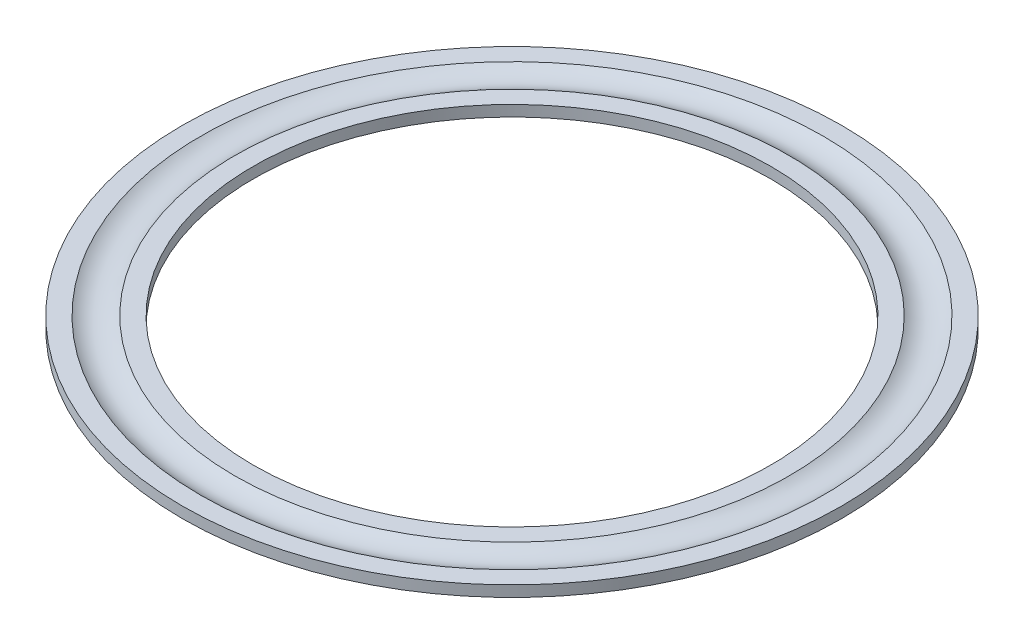
ISO-10303-21;
HEADER;
FILE_DESCRIPTION(('STEP AP214'),'2;1');
FILE_NAME('part.step','',(''),(''),'','','');
FILE_SCHEMA(('AUTOMOTIVE_DESIGN { 1 0 10303 214 1 1 1 1 }'));
ENDSEC;
DATA;
#1=APPLICATION_CONTEXT('core data for automotive mechanical design processes');
#2=APPLICATION_PROTOCOL_DEFINITION('international standard','automotive_design',2000,#1);
#3=PRODUCT_CONTEXT('',#1,'mechanical');
#4=PRODUCT('Part','Part','',(#3));
#5=PRODUCT_RELATED_PRODUCT_CATEGORY('part','',(#4));
#6=PRODUCT_DEFINITION_FORMATION('','',#4);
#7=PRODUCT_DEFINITION_CONTEXT('part definition',#1,'design');
#8=PRODUCT_DEFINITION('design','',#6,#7);
#9=PRODUCT_DEFINITION_SHAPE('','',#8);
#10=(LENGTH_UNIT() NAMED_UNIT(*) SI_UNIT(.MILLI.,.METRE.));
#11=(NAMED_UNIT(*) PLANE_ANGLE_UNIT() SI_UNIT($,.RADIAN.));
#12=(NAMED_UNIT(*) SI_UNIT($,.STERADIAN.) SOLID_ANGLE_UNIT());
#13=UNCERTAINTY_MEASURE_WITH_UNIT(LENGTH_MEASURE(1.E-05),#10,'distance_accuracy_value','');
#14=(GEOMETRIC_REPRESENTATION_CONTEXT(3) GLOBAL_UNCERTAINTY_ASSIGNED_CONTEXT((#13)) GLOBAL_UNIT_ASSIGNED_CONTEXT((#10,
#11,#12)) REPRESENTATION_CONTEXT('',''));
#15=CARTESIAN_POINT('',(0.,0.,0.));
#16=DIRECTION('',(0.,0.,1.));
#17=DIRECTION('',(1.,0.,0.));
#18=AXIS2_PLACEMENT_3D('',#15,#16,#17);
#19=CARTESIAN_POINT('',(0.,0.,0.));
#20=DIRECTION('',(0.,1.,0.));
#21=DIRECTION('',(0.,0.,1.));
#22=AXIS2_PLACEMENT_3D('',#19,#20,#21);
#23=CYLINDRICAL_SURFACE('',#22,60.4);
#24=CARTESIAN_POINT('',(0.,0.,0.));
#25=DIRECTION('',(0.,1.,0.));
#26=DIRECTION('',(0.,0.,1.));
#27=AXIS2_PLACEMENT_3D('',#24,#25,#26);
#28=CIRCLE('',#27,60.4);
#29=CARTESIAN_POINT('',(0.,0.,60.4));
#30=VERTEX_POINT('',#29);
#31=EDGE_CURVE('E53',#30,#30,#28,.T.);
#32=ORIENTED_EDGE('',*,*,#31,.T.);
#33=EDGE_LOOP('',(#32));
#34=FACE_BOUND('',#33,.T.);
#35=CARTESIAN_POINT('',(0.,2.,0.));
#36=DIRECTION('',(0.,1.,0.));
#37=DIRECTION('',(0.,0.,1.));
#38=AXIS2_PLACEMENT_3D('',#35,#36,#37);
#39=CIRCLE('',#38,60.4);
#40=CARTESIAN_POINT('',(0.,2.,60.4));
#41=VERTEX_POINT('',#40);
#42=EDGE_CURVE('E10',#41,#41,#39,.T.);
#43=ORIENTED_EDGE('',*,*,#42,.F.);
#44=EDGE_LOOP('',(#43));
#45=FACE_BOUND('',#44,.T.);
#46=ADVANCED_FACE('F31',(#34,#45),#23,.T.);
#47=CARTESIAN_POINT('',(57.,2.,0.));
#48=DIRECTION('',(0.,1.,0.));
#49=DIRECTION('',(0.,0.,1.));
#50=AXIS2_PLACEMENT_3D('',#47,#48,#49);
#51=PLANE('',#50);
#52=ORIENTED_EDGE('',*,*,#42,.T.);
#53=EDGE_LOOP('',(#52));
#54=FACE_BOUND('',#53,.T.);
#55=CARTESIAN_POINT('',(0.,2.,0.));
#56=DIRECTION('',(0.,1.,0.));
#57=DIRECTION('',(0.,0.,1.));
#58=AXIS2_PLACEMENT_3D('',#55,#56,#57);
#59=CIRCLE('',#58,57.);
#60=CARTESIAN_POINT('',(0.,2.,57.));
#61=VERTEX_POINT('',#60);
#62=EDGE_CURVE('E37',#61,#61,#59,.T.);
#63=ORIENTED_EDGE('',*,*,#62,.F.);
#64=EDGE_LOOP('',(#63));
#65=FACE_BOUND('',#64,.T.);
#66=ADVANCED_FACE('F71',(#54,#65),#51,.T.);
#67=CARTESIAN_POINT('',(0.,6.12760000000016,0.));
#68=DIRECTION('',(0.,1.,0.));
#69=DIRECTION('',(0.,0.,1.));
#70=AXIS2_PLACEMENT_3D('',#67,#68,#69);
#71=TOROIDAL_SURFACE('',#70,53.9043,5.15950000000013);
#72=ORIENTED_EDGE('',*,*,#62,.T.);
#73=EDGE_LOOP('',(#72));
#74=FACE_BOUND('',#73,.T.);
#75=CARTESIAN_POINT('',(0.,2.,0.));
#76=DIRECTION('',(0.,1.,0.));
#77=DIRECTION('',(0.,0.,1.));
#78=AXIS2_PLACEMENT_3D('',#75,#76,#77);
#79=CIRCLE('',#78,50.8086);
#80=CARTESIAN_POINT('',(0.,2.,50.8086));
#81=VERTEX_POINT('',#80);
#82=EDGE_CURVE('E41',#81,#81,#79,.T.);
#83=ORIENTED_EDGE('',*,*,#82,.F.);
#84=EDGE_LOOP('',(#83));
#85=FACE_BOUND('',#84,.T.);
#86=ADVANCED_FACE('F75',(#74,#85),#71,.F.);
#87=CARTESIAN_POINT('',(47.4086,2.,0.));
#88=DIRECTION('',(0.,1.,0.));
#89=DIRECTION('',(0.,0.,1.));
#90=AXIS2_PLACEMENT_3D('',#87,#88,#89);
#91=PLANE('',#90);
#92=ORIENTED_EDGE('',*,*,#82,.T.);
#93=EDGE_LOOP('',(#92));
#94=FACE_BOUND('',#93,.T.);
#95=CARTESIAN_POINT('',(0.,2.,0.));
#96=DIRECTION('',(0.,1.,0.));
#97=DIRECTION('',(0.,0.,1.));
#98=AXIS2_PLACEMENT_3D('',#95,#96,#97);
#99=CIRCLE('',#98,47.4086);
#100=CARTESIAN_POINT('',(0.,2.,47.4086));
#101=VERTEX_POINT('',#100);
#102=EDGE_CURVE('E45',#101,#101,#99,.T.);
#103=ORIENTED_EDGE('',*,*,#102,.F.);
#104=EDGE_LOOP('',(#103));
#105=FACE_BOUND('',#104,.T.);
#106=ADVANCED_FACE('F67',(#94,#105),#91,.T.);
#107=CARTESIAN_POINT('',(0.,0.,0.));
#108=DIRECTION('',(0.,1.,0.));
#109=DIRECTION('',(0.,0.,1.));
#110=AXIS2_PLACEMENT_3D('',#107,#108,#109);
#111=CYLINDRICAL_SURFACE('',#110,47.4086);
#112=ORIENTED_EDGE('',*,*,#102,.T.);
#113=EDGE_LOOP('',(#112));
#114=FACE_BOUND('',#113,.T.);
#115=CARTESIAN_POINT('',(0.,0.,0.));
#116=DIRECTION('',(0.,1.,0.));
#117=DIRECTION('',(0.,0.,1.));
#118=AXIS2_PLACEMENT_3D('',#115,#116,#117);
#119=CIRCLE('',#118,47.4086);
#120=CARTESIAN_POINT('',(0.,0.,47.4086));
#121=VERTEX_POINT('',#120);
#122=EDGE_CURVE('E50',#121,#121,#119,.T.);
#123=ORIENTED_EDGE('',*,*,#122,.F.);
#124=EDGE_LOOP('',(#123));
#125=FACE_BOUND('',#124,.T.);
#126=ADVANCED_FACE('F61',(#114,#125),#111,.F.);
#127=CARTESIAN_POINT('',(60.4,0.,0.));
#128=DIRECTION('',(0.,-1.,0.));
#129=DIRECTION('',(0.,0.,-1.));
#130=AXIS2_PLACEMENT_3D('',#127,#128,#129);
#131=PLANE('',#130);
#132=ORIENTED_EDGE('',*,*,#122,.T.);
#133=EDGE_LOOP('',(#132));
#134=FACE_BOUND('',#133,.T.);
#135=ORIENTED_EDGE('',*,*,#31,.F.);
#136=EDGE_LOOP('',(#135));
#137=FACE_BOUND('',#136,.T.);
#138=ADVANCED_FACE('F59',(#134,#137),#131,.T.);
#139=CLOSED_SHELL('',(#46,#66,#86,#106,#126,#138));
#140=MANIFOLD_SOLID_BREP('B2',#139);
#141=ADVANCED_BREP_SHAPE_REPRESENTATION('',(#18,#140),#14);
#142=SHAPE_DEFINITION_REPRESENTATION(#9,#141);
ENDSEC;
END-ISO-10303-21;
